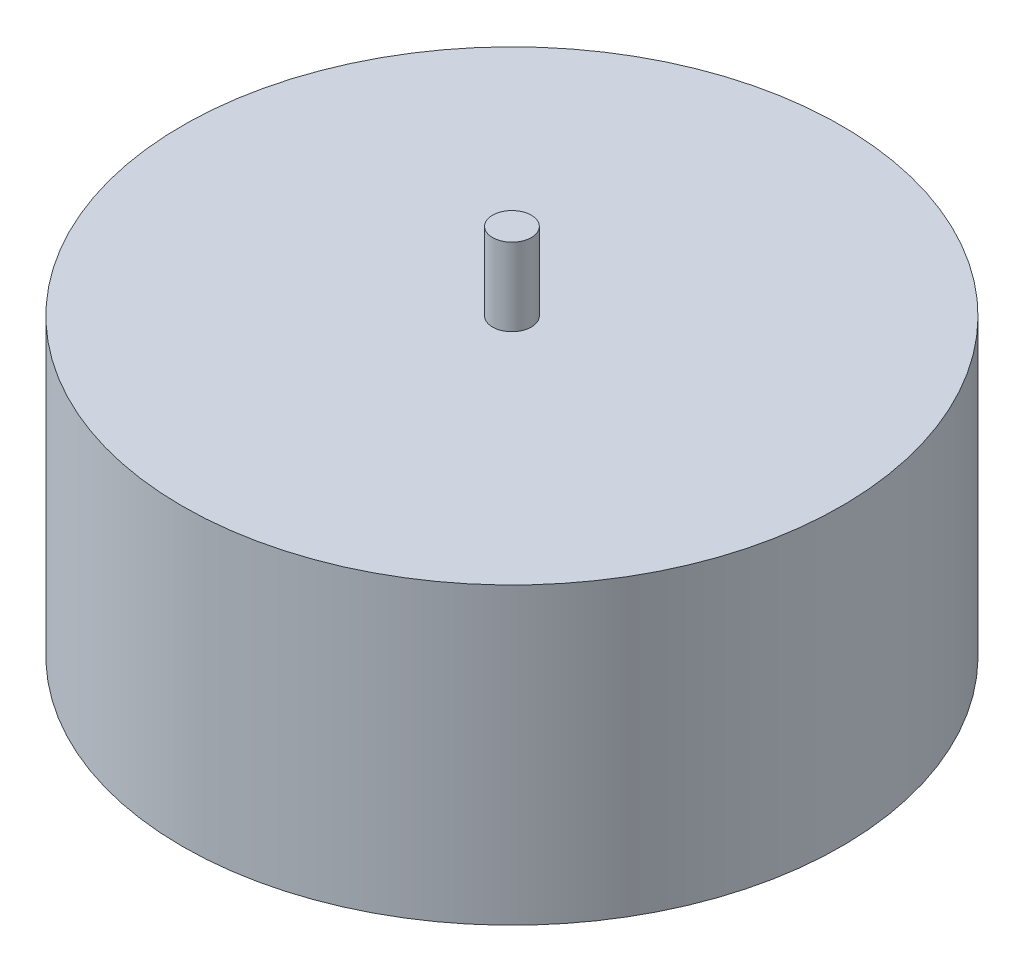
ISO-10303-21;
HEADER;
FILE_DESCRIPTION(('STEP AP214'),'2;1');
FILE_NAME('part.step','',(''),(''),'','','');
FILE_SCHEMA(('AUTOMOTIVE_DESIGN { 1 0 10303 214 1 1 1 1 }'));
ENDSEC;
DATA;
#1=APPLICATION_CONTEXT('core data for automotive mechanical design processes');
#2=APPLICATION_PROTOCOL_DEFINITION('international standard','automotive_design',2000,#1);
#3=PRODUCT_CONTEXT('',#1,'mechanical');
#4=PRODUCT('Part','Part','',(#3));
#5=PRODUCT_RELATED_PRODUCT_CATEGORY('part','',(#4));
#6=PRODUCT_DEFINITION_FORMATION('','',#4);
#7=PRODUCT_DEFINITION_CONTEXT('part definition',#1,'design');
#8=PRODUCT_DEFINITION('design','',#6,#7);
#9=PRODUCT_DEFINITION_SHAPE('','',#8);
#10=(LENGTH_UNIT() NAMED_UNIT(*) SI_UNIT(.MILLI.,.METRE.));
#11=(NAMED_UNIT(*) PLANE_ANGLE_UNIT() SI_UNIT($,.RADIAN.));
#12=(NAMED_UNIT(*) SI_UNIT($,.STERADIAN.) SOLID_ANGLE_UNIT());
#13=UNCERTAINTY_MEASURE_WITH_UNIT(LENGTH_MEASURE(1.E-05),#10,'distance_accuracy_value','');
#14=(GEOMETRIC_REPRESENTATION_CONTEXT(3) GLOBAL_UNCERTAINTY_ASSIGNED_CONTEXT((#13)) GLOBAL_UNIT_ASSIGNED_CONTEXT((#10,
#11,#12)) REPRESENTATION_CONTEXT('',''));
#15=CARTESIAN_POINT('',(0.,0.,0.));
#16=DIRECTION('',(0.,0.,1.));
#17=DIRECTION('',(1.,0.,0.));
#18=AXIS2_PLACEMENT_3D('',#15,#16,#17);
#19=CARTESIAN_POINT('',(0.,38.,0.));
#20=DIRECTION('',(0.,-1.,0.));
#21=DIRECTION('',(0.,0.,-1.));
#22=AXIS2_PLACEMENT_3D('',#19,#20,#21);
#23=CYLINDRICAL_SURFACE('',#22,42.5);
#24=CARTESIAN_POINT('',(0.,38.,0.));
#25=DIRECTION('',(0.,1.,0.));
#26=DIRECTION('',(0.,0.,1.));
#27=AXIS2_PLACEMENT_3D('',#24,#25,#26);
#28=CIRCLE('',#27,42.5);
#29=CARTESIAN_POINT('',(0.,38.,42.5));
#30=VERTEX_POINT('',#29);
#31=EDGE_CURVE('E10',#30,#30,#28,.T.);
#32=ORIENTED_EDGE('',*,*,#31,.F.);
#33=EDGE_LOOP('',(#32));
#34=FACE_BOUND('',#33,.T.);
#35=CARTESIAN_POINT('',(0.,0.,0.));
#36=DIRECTION('',(0.,1.,0.));
#37=DIRECTION('',(0.,0.,1.));
#38=AXIS2_PLACEMENT_3D('',#35,#36,#37);
#39=CIRCLE('',#38,42.5);
#40=CARTESIAN_POINT('',(0.,0.,42.5));
#41=VERTEX_POINT('',#40);
#42=EDGE_CURVE('E40',#41,#41,#39,.T.);
#43=ORIENTED_EDGE('',*,*,#42,.T.);
#44=EDGE_LOOP('',(#43));
#45=FACE_BOUND('',#44,.T.);
#46=ADVANCED_FACE('F37',(#34,#45),#23,.T.);
#47=CARTESIAN_POINT('',(0.,38.,0.));
#48=DIRECTION('',(0.,1.,0.));
#49=DIRECTION('',(0.,0.,1.));
#50=AXIS2_PLACEMENT_3D('',#47,#48,#49);
#51=PLANE('',#50);
#52=CARTESIAN_POINT('',(0.,38.,0.));
#53=DIRECTION('',(0.,1.,0.));
#54=DIRECTION('',(0.,0.,1.));
#55=AXIS2_PLACEMENT_3D('',#52,#53,#54);
#56=CIRCLE('',#55,2.5);
#57=CARTESIAN_POINT('',(0.,38.,2.5));
#58=VERTEX_POINT('',#57);
#59=EDGE_CURVE('E51',#58,#58,#56,.T.);
#60=ORIENTED_EDGE('',*,*,#59,.F.);
#61=EDGE_LOOP('',(#60));
#62=FACE_BOUND('',#61,.T.);
#63=ORIENTED_EDGE('',*,*,#31,.T.);
#64=EDGE_LOOP('',(#63));
#65=FACE_BOUND('',#64,.T.);
#66=ADVANCED_FACE('F68',(#62,#65),#51,.T.);
#67=CARTESIAN_POINT('',(0.,0.,0.));
#68=DIRECTION('',(0.,1.,0.));
#69=DIRECTION('',(0.,0.,1.));
#70=AXIS2_PLACEMENT_3D('',#67,#68,#69);
#71=PLANE('',#70);
#72=ORIENTED_EDGE('',*,*,#42,.F.);
#73=EDGE_LOOP('',(#72));
#74=FACE_BOUND('',#73,.T.);
#75=ADVANCED_FACE('F64',(#74),#71,.F.);
#76=CARTESIAN_POINT('',(0.,48.,0.));
#77=DIRECTION('',(0.,-1.,0.));
#78=DIRECTION('',(0.,0.,-1.));
#79=AXIS2_PLACEMENT_3D('',#76,#77,#78);
#80=CYLINDRICAL_SURFACE('',#79,2.5);
#81=CARTESIAN_POINT('',(0.,48.,0.));
#82=DIRECTION('',(0.,1.,0.));
#83=DIRECTION('',(0.,0.,1.));
#84=AXIS2_PLACEMENT_3D('',#81,#82,#83);
#85=CIRCLE('',#84,2.5);
#86=CARTESIAN_POINT('',(0.,48.,2.5));
#87=VERTEX_POINT('',#86);
#88=EDGE_CURVE('E49',#87,#87,#85,.T.);
#89=ORIENTED_EDGE('',*,*,#88,.F.);
#90=EDGE_LOOP('',(#89));
#91=FACE_BOUND('',#90,.T.);
#92=ORIENTED_EDGE('',*,*,#59,.T.);
#93=EDGE_LOOP('',(#92));
#94=FACE_BOUND('',#93,.T.);
#95=ADVANCED_FACE('F61',(#91,#94),#80,.T.);
#96=CARTESIAN_POINT('',(0.,48.,0.));
#97=DIRECTION('',(0.,1.,0.));
#98=DIRECTION('',(0.,0.,1.));
#99=AXIS2_PLACEMENT_3D('',#96,#97,#98);
#100=PLANE('',#99);
#101=ORIENTED_EDGE('',*,*,#88,.T.);
#102=EDGE_LOOP('',(#101));
#103=FACE_BOUND('',#102,.T.);
#104=ADVANCED_FACE('F59',(#103),#100,.T.);
#105=CLOSED_SHELL('',(#46,#66,#75,#95,#104));
#106=MANIFOLD_SOLID_BREP('B2',#105);
#107=ADVANCED_BREP_SHAPE_REPRESENTATION('',(#18,#106),#14);
#108=SHAPE_DEFINITION_REPRESENTATION(#9,#107);
ENDSEC;
END-ISO-10303-21;
